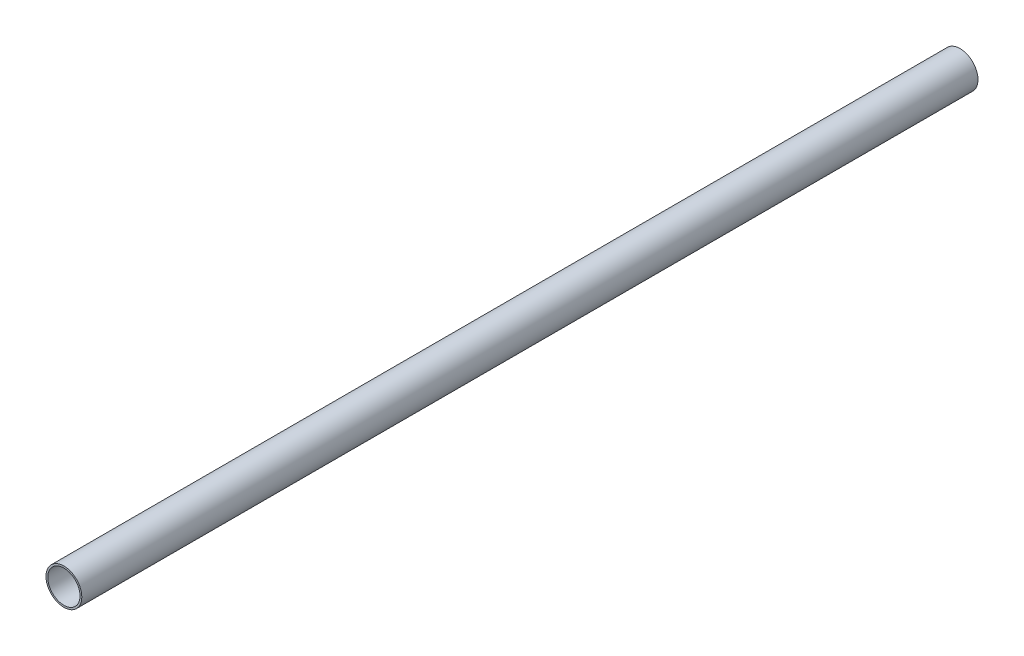
ISO-10303-21;
HEADER;
FILE_DESCRIPTION(('STEP AP214'),'2;1');
FILE_NAME('part.step','',(''),(''),'','','');
FILE_SCHEMA(('AUTOMOTIVE_DESIGN { 1 0 10303 214 1 1 1 1 }'));
ENDSEC;
DATA;
#1=APPLICATION_CONTEXT('core data for automotive mechanical design processes');
#2=APPLICATION_PROTOCOL_DEFINITION('international standard','automotive_design',2000,#1);
#3=PRODUCT_CONTEXT('',#1,'mechanical');
#4=PRODUCT('Part','Part','',(#3));
#5=PRODUCT_RELATED_PRODUCT_CATEGORY('part','',(#4));
#6=PRODUCT_DEFINITION_FORMATION('','',#4);
#7=PRODUCT_DEFINITION_CONTEXT('part definition',#1,'design');
#8=PRODUCT_DEFINITION('design','',#6,#7);
#9=PRODUCT_DEFINITION_SHAPE('','',#8);
#10=(LENGTH_UNIT() NAMED_UNIT(*) SI_UNIT(.MILLI.,.METRE.));
#11=(NAMED_UNIT(*) PLANE_ANGLE_UNIT() SI_UNIT($,.RADIAN.));
#12=(NAMED_UNIT(*) SI_UNIT($,.STERADIAN.) SOLID_ANGLE_UNIT());
#13=UNCERTAINTY_MEASURE_WITH_UNIT(LENGTH_MEASURE(1.E-05),#10,'distance_accuracy_value','');
#14=(GEOMETRIC_REPRESENTATION_CONTEXT(3) GLOBAL_UNCERTAINTY_ASSIGNED_CONTEXT((#13)) GLOBAL_UNIT_ASSIGNED_CONTEXT((#10,
#11,#12)) REPRESENTATION_CONTEXT('',''));
#15=CARTESIAN_POINT('',(0.,0.,0.));
#16=DIRECTION('',(0.,0.,1.));
#17=DIRECTION('',(1.,0.,0.));
#18=AXIS2_PLACEMENT_3D('',#15,#16,#17);
#19=CARTESIAN_POINT('',(0.,0.,500.));
#20=DIRECTION('',(0.,0.,1.));
#21=DIRECTION('',(1.,0.,0.));
#22=AXIS2_PLACEMENT_3D('',#19,#20,#21);
#23=PLANE('',#22);
#24=CARTESIAN_POINT('',(0.,0.,500.));
#25=DIRECTION('',(0.,0.,1.));
#26=DIRECTION('',(1.,0.,0.));
#27=AXIS2_PLACEMENT_3D('',#24,#25,#26);
#28=CIRCLE('',#27,10.);
#29=CARTESIAN_POINT('',(10.,0.,500.));
#30=VERTEX_POINT('',#29);
#31=EDGE_CURVE('E10',#30,#30,#28,.T.);
#32=ORIENTED_EDGE('',*,*,#31,.T.);
#33=EDGE_LOOP('',(#32));
#34=FACE_BOUND('',#33,.T.);
#35=CARTESIAN_POINT('',(0.,0.,500.));
#36=DIRECTION('',(0.,0.,1.));
#37=DIRECTION('',(1.,0.,0.));
#38=AXIS2_PLACEMENT_3D('',#35,#36,#37);
#39=CIRCLE('',#38,9.);
#40=CARTESIAN_POINT('',(9.,0.,500.));
#41=VERTEX_POINT('',#40);
#42=EDGE_CURVE('E56',#41,#41,#39,.T.);
#43=ORIENTED_EDGE('',*,*,#42,.F.);
#44=EDGE_LOOP('',(#43));
#45=FACE_BOUND('',#44,.T.);
#46=ADVANCED_FACE('F43',(#34,#45),#23,.T.);
#47=CARTESIAN_POINT('',(0.,0.,0.));
#48=DIRECTION('',(0.,0.,1.));
#49=DIRECTION('',(1.,0.,0.));
#50=AXIS2_PLACEMENT_3D('',#47,#48,#49);
#51=PLANE('',#50);
#52=CARTESIAN_POINT('',(0.,0.,0.));
#53=DIRECTION('',(0.,0.,1.));
#54=DIRECTION('',(1.,0.,0.));
#55=AXIS2_PLACEMENT_3D('',#52,#53,#54);
#56=CIRCLE('',#55,10.);
#57=CARTESIAN_POINT('',(10.,0.,0.));
#58=VERTEX_POINT('',#57);
#59=EDGE_CURVE('E47',#58,#58,#56,.T.);
#60=ORIENTED_EDGE('',*,*,#59,.F.);
#61=EDGE_LOOP('',(#60));
#62=FACE_BOUND('',#61,.T.);
#63=CARTESIAN_POINT('',(0.,0.,0.));
#64=DIRECTION('',(0.,0.,1.));
#65=DIRECTION('',(1.,0.,0.));
#66=AXIS2_PLACEMENT_3D('',#63,#64,#65);
#67=CIRCLE('',#66,9.);
#68=CARTESIAN_POINT('',(9.,0.,0.));
#69=VERTEX_POINT('',#68);
#70=EDGE_CURVE('E58',#69,#69,#67,.T.);
#71=ORIENTED_EDGE('',*,*,#70,.T.);
#72=EDGE_LOOP('',(#71));
#73=FACE_BOUND('',#72,.T.);
#74=ADVANCED_FACE('F70',(#62,#73),#51,.F.);
#75=CARTESIAN_POINT('',(0.,0.,500.));
#76=DIRECTION('',(0.,0.,-1.));
#77=DIRECTION('',(-1.,0.,0.));
#78=AXIS2_PLACEMENT_3D('',#75,#76,#77);
#79=CYLINDRICAL_SURFACE('',#78,10.);
#80=ORIENTED_EDGE('',*,*,#31,.F.);
#81=EDGE_LOOP('',(#80));
#82=FACE_BOUND('',#81,.T.);
#83=ORIENTED_EDGE('',*,*,#59,.T.);
#84=EDGE_LOOP('',(#83));
#85=FACE_BOUND('',#84,.T.);
#86=ADVANCED_FACE('F45',(#82,#85),#79,.T.);
#87=CARTESIAN_POINT('',(0.,0.,500.));
#88=DIRECTION('',(0.,0.,-1.));
#89=DIRECTION('',(-1.,0.,0.));
#90=AXIS2_PLACEMENT_3D('',#87,#88,#89);
#91=CYLINDRICAL_SURFACE('',#90,9.);
#92=ORIENTED_EDGE('',*,*,#42,.T.);
#93=EDGE_LOOP('',(#92));
#94=FACE_BOUND('',#93,.T.);
#95=ORIENTED_EDGE('',*,*,#70,.F.);
#96=EDGE_LOOP('',(#95));
#97=FACE_BOUND('',#96,.T.);
#98=ADVANCED_FACE('F66',(#94,#97),#91,.F.);
#99=CLOSED_SHELL('',(#46,#74,#86,#98));
#100=MANIFOLD_SOLID_BREP('B2',#99);
#101=ADVANCED_BREP_SHAPE_REPRESENTATION('',(#18,#100),#14);
#102=SHAPE_DEFINITION_REPRESENTATION(#9,#101);
ENDSEC;
END-ISO-10303-21;
